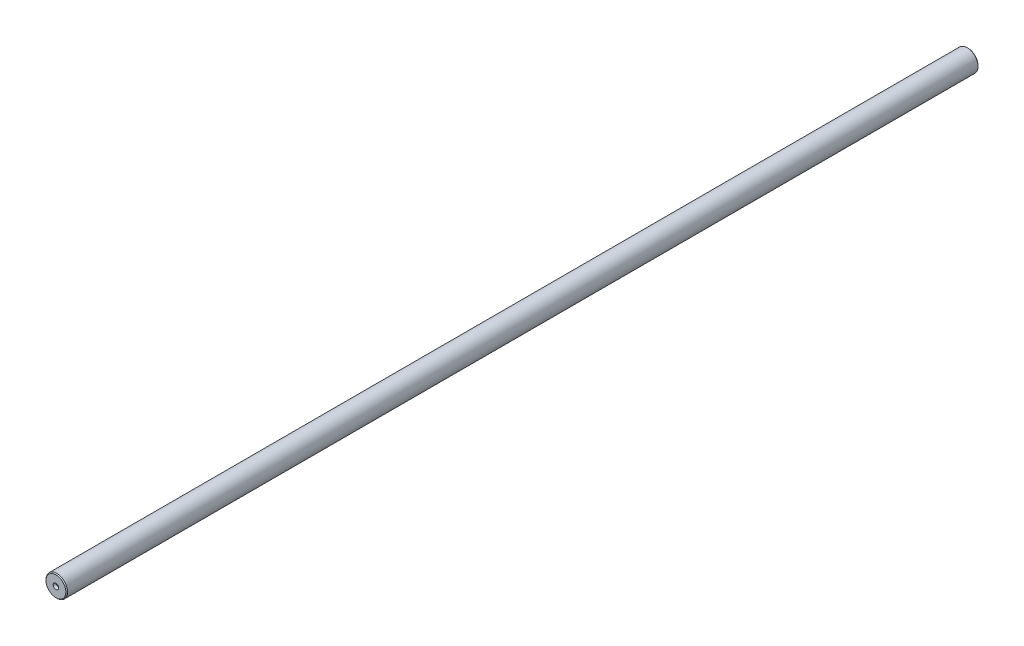
ISO-10303-21;
HEADER;
FILE_DESCRIPTION(('STEP AP214'),'2;1');
FILE_NAME('part.step','',(''),(''),'','','');
FILE_SCHEMA(('AUTOMOTIVE_DESIGN { 1 0 10303 214 1 1 1 1 }'));
ENDSEC;
DATA;
#1=APPLICATION_CONTEXT('core data for automotive mechanical design processes');
#2=APPLICATION_PROTOCOL_DEFINITION('international standard','automotive_design',2000,#1);
#3=PRODUCT_CONTEXT('',#1,'mechanical');
#4=PRODUCT('Part','Part','',(#3));
#5=PRODUCT_RELATED_PRODUCT_CATEGORY('part','',(#4));
#6=PRODUCT_DEFINITION_FORMATION('','',#4);
#7=PRODUCT_DEFINITION_CONTEXT('part definition',#1,'design');
#8=PRODUCT_DEFINITION('design','',#6,#7);
#9=PRODUCT_DEFINITION_SHAPE('','',#8);
#10=(LENGTH_UNIT() NAMED_UNIT(*) SI_UNIT(.MILLI.,.METRE.));
#11=(NAMED_UNIT(*) PLANE_ANGLE_UNIT() SI_UNIT($,.RADIAN.));
#12=(NAMED_UNIT(*) SI_UNIT($,.STERADIAN.) SOLID_ANGLE_UNIT());
#13=UNCERTAINTY_MEASURE_WITH_UNIT(LENGTH_MEASURE(1.E-05),#10,'distance_accuracy_value','');
#14=(GEOMETRIC_REPRESENTATION_CONTEXT(3) GLOBAL_UNCERTAINTY_ASSIGNED_CONTEXT((#13)) GLOBAL_UNIT_ASSIGNED_CONTEXT((#10,
#11,#12)) REPRESENTATION_CONTEXT('',''));
#15=CARTESIAN_POINT('',(0.,0.,0.));
#16=DIRECTION('',(0.,0.,1.));
#17=DIRECTION('',(1.,0.,0.));
#18=AXIS2_PLACEMENT_3D('',#15,#16,#17);
#19=CARTESIAN_POINT('',(0.,0.,528.));
#20=DIRECTION('',(0.,0.,-1.));
#21=DIRECTION('',(-1.,0.,0.));
#22=AXIS2_PLACEMENT_3D('',#19,#20,#21);
#23=CYLINDRICAL_SURFACE('',#22,12.5);
#24=CARTESIAN_POINT('',(0.,0.,527.));
#25=DIRECTION('',(0.,0.,1.));
#26=DIRECTION('',(1.,0.,0.));
#27=AXIS2_PLACEMENT_3D('',#24,#25,#26);
#28=CIRCLE('',#27,12.5);
#29=CARTESIAN_POINT('',(12.5,0.,527.));
#30=VERTEX_POINT('',#29);
#31=EDGE_CURVE('E55',#30,#30,#28,.F.);
#32=ORIENTED_EDGE('',*,*,#31,.T.);
#33=EDGE_LOOP('',(#32));
#34=FACE_BOUND('',#33,.T.);
#35=CARTESIAN_POINT('',(0.,0.,-527.));
#36=DIRECTION('',(0.,0.,1.));
#37=DIRECTION('',(1.,0.,0.));
#38=AXIS2_PLACEMENT_3D('',#35,#36,#37);
#39=CIRCLE('',#38,12.5);
#40=CARTESIAN_POINT('',(12.5,0.,-527.));
#41=VERTEX_POINT('',#40);
#42=EDGE_CURVE('E96',#41,#41,#39,.T.);
#43=ORIENTED_EDGE('',*,*,#42,.T.);
#44=EDGE_LOOP('',(#43));
#45=FACE_BOUND('',#44,.T.);
#46=ADVANCED_FACE('F45',(#34,#45),#23,.T.);
#47=CARTESIAN_POINT('',(0.,0.,528.));
#48=DIRECTION('',(0.,0.,1.));
#49=DIRECTION('',(1.,0.,0.));
#50=AXIS2_PLACEMENT_3D('',#47,#48,#49);
#51=PLANE('',#50);
#52=CARTESIAN_POINT('',(0.,0.,528.));
#53=DIRECTION('',(0.,0.,1.));
#54=DIRECTION('',(1.,0.,0.));
#55=AXIS2_PLACEMENT_3D('',#52,#53,#54);
#56=CIRCLE('',#55,11.5000000000001);
#57=CARTESIAN_POINT('',(11.5000000000001,0.,528.));
#58=VERTEX_POINT('',#57);
#59=EDGE_CURVE('E92',#58,#58,#56,.T.);
#60=ORIENTED_EDGE('',*,*,#59,.T.);
#61=EDGE_LOOP('',(#60));
#62=FACE_BOUND('',#61,.T.);
#63=CARTESIAN_POINT('',(0.,0.,528.));
#64=DIRECTION('',(0.,0.,1.));
#65=DIRECTION('',(1.,0.,0.));
#66=AXIS2_PLACEMENT_3D('',#63,#64,#65);
#67=CIRCLE('',#66,3.15);
#68=CARTESIAN_POINT('',(3.15,0.,528.));
#69=VERTEX_POINT('',#68);
#70=EDGE_CURVE('E81',#69,#69,#67,.T.);
#71=ORIENTED_EDGE('',*,*,#70,.F.);
#72=EDGE_LOOP('',(#71));
#73=FACE_BOUND('',#72,.T.);
#74=ADVANCED_FACE('F111',(#62,#73),#51,.T.);
#75=CARTESIAN_POINT('',(0.,0.,-528.));
#76=DIRECTION('',(0.,0.,1.));
#77=DIRECTION('',(1.,0.,0.));
#78=AXIS2_PLACEMENT_3D('',#75,#76,#77);
#79=PLANE('',#78);
#80=CARTESIAN_POINT('',(0.,0.,-528.));
#81=DIRECTION('',(0.,0.,1.));
#82=DIRECTION('',(1.,0.,0.));
#83=AXIS2_PLACEMENT_3D('',#80,#81,#82);
#84=CIRCLE('',#83,11.4999999999998);
#85=CARTESIAN_POINT('',(11.4999999999998,0.,-528.));
#86=VERTEX_POINT('',#85);
#87=EDGE_CURVE('E11',#86,#86,#84,.F.);
#88=ORIENTED_EDGE('',*,*,#87,.T.);
#89=EDGE_LOOP('',(#88));
#90=FACE_BOUND('',#89,.T.);
#91=CARTESIAN_POINT('',(0.,0.,-528.));
#92=DIRECTION('',(0.,0.,-1.));
#93=DIRECTION('',(-1.,0.,0.));
#94=AXIS2_PLACEMENT_3D('',#91,#92,#93);
#95=CIRCLE('',#94,3.15);
#96=CARTESIAN_POINT('',(-3.15,0.,-528.));
#97=VERTEX_POINT('',#96);
#98=EDGE_CURVE('E72',#97,#97,#95,.T.);
#99=ORIENTED_EDGE('',*,*,#98,.F.);
#100=EDGE_LOOP('',(#99));
#101=FACE_BOUND('',#100,.T.);
#102=ADVANCED_FACE('F114',(#90,#101),#79,.F.);
#103=CARTESIAN_POINT('',(0.,0.,-519.021463052347));
#104=DIRECTION('',(0.,0.,-1.));
#105=DIRECTION('',(-1.,0.,0.));
#106=AXIS2_PLACEMENT_3D('',#103,#104,#105);
#107=CONICAL_SURFACE('',#106,1.7,1.02974425867665);
#108=CARTESIAN_POINT('',(0.,0.,-518.));
#109=VERTEX_POINT('',#108);
#110=VERTEX_LOOP('',#109);
#111=FACE_BOUND('',#110,.T.);
#112=CARTESIAN_POINT('',(0.,0.,-519.021463052347));
#113=DIRECTION('',(0.,0.,-1.));
#114=DIRECTION('',(-1.,0.,0.));
#115=AXIS2_PLACEMENT_3D('',#112,#113,#114);
#116=CIRCLE('',#115,1.7);
#117=CARTESIAN_POINT('',(-1.7,0.,-519.021463052347));
#118=VERTEX_POINT('',#117);
#119=EDGE_CURVE('E88',#118,#118,#116,.T.);
#120=ORIENTED_EDGE('',*,*,#119,.T.);
#121=EDGE_LOOP('',(#120));
#122=FACE_BOUND('',#121,.T.);
#123=ADVANCED_FACE('F139',(#111,#122),#107,.F.);
#124=CARTESIAN_POINT('',(0.,0.,-528.));
#125=DIRECTION('',(0.,0.,-1.));
#126=DIRECTION('',(-1.,0.,0.));
#127=AXIS2_PLACEMENT_3D('',#124,#125,#126);
#128=CYLINDRICAL_SURFACE('',#127,1.7);
#129=ORIENTED_EDGE('',*,*,#119,.F.);
#130=EDGE_LOOP('',(#129));
#131=FACE_BOUND('',#130,.T.);
#132=CARTESIAN_POINT('',(0.,0.,-525.488526329025));
#133=DIRECTION('',(0.,0.,-1.));
#134=DIRECTION('',(-1.,0.,0.));
#135=AXIS2_PLACEMENT_3D('',#132,#133,#134);
#136=CIRCLE('',#135,1.7);
#137=CARTESIAN_POINT('',(-1.7,0.,-525.488526329025));
#138=VERTEX_POINT('',#137);
#139=EDGE_CURVE('E78',#138,#138,#136,.T.);
#140=ORIENTED_EDGE('',*,*,#139,.T.);
#141=EDGE_LOOP('',(#140));
#142=FACE_BOUND('',#141,.T.);
#143=ADVANCED_FACE('F144',(#131,#142),#128,.F.);
#144=CARTESIAN_POINT('',(0.,0.,-528.));
#145=DIRECTION('',(0.,0.,-1.));
#146=DIRECTION('',(-1.,0.,0.));
#147=AXIS2_PLACEMENT_3D('',#144,#145,#146);
#148=CONICAL_SURFACE('',#147,3.15,0.523598775598309);
#149=ORIENTED_EDGE('',*,*,#139,.F.);
#150=EDGE_LOOP('',(#149));
#151=FACE_BOUND('',#150,.T.);
#152=ORIENTED_EDGE('',*,*,#98,.T.);
#153=EDGE_LOOP('',(#152));
#154=FACE_BOUND('',#153,.T.);
#155=ADVANCED_FACE('F65',(#151,#154),#148,.F.);
#156=CARTESIAN_POINT('',(0.,0.,519.021463052347));
#157=DIRECTION('',(0.,0.,1.));
#158=DIRECTION('',(1.,0.,0.));
#159=AXIS2_PLACEMENT_3D('',#156,#157,#158);
#160=CONICAL_SURFACE('',#159,1.7,1.02974425867665);
#161=CARTESIAN_POINT('',(0.,0.,518.));
#162=VERTEX_POINT('',#161);
#163=VERTEX_LOOP('',#162);
#164=FACE_BOUND('',#163,.T.);
#165=CARTESIAN_POINT('',(0.,0.,519.021463052347));
#166=DIRECTION('',(0.,0.,1.));
#167=DIRECTION('',(1.,0.,0.));
#168=AXIS2_PLACEMENT_3D('',#165,#166,#167);
#169=CIRCLE('',#168,1.7);
#170=CARTESIAN_POINT('',(1.7,0.,519.021463052347));
#171=VERTEX_POINT('',#170);
#172=EDGE_CURVE('E69',#171,#171,#169,.T.);
#173=ORIENTED_EDGE('',*,*,#172,.T.);
#174=EDGE_LOOP('',(#173));
#175=FACE_BOUND('',#174,.T.);
#176=ADVANCED_FACE('F61',(#164,#175),#160,.F.);
#177=CARTESIAN_POINT('',(0.,0.,528.));
#178=DIRECTION('',(0.,0.,1.));
#179=DIRECTION('',(1.,0.,0.));
#180=AXIS2_PLACEMENT_3D('',#177,#178,#179);
#181=CYLINDRICAL_SURFACE('',#180,1.7);
#182=ORIENTED_EDGE('',*,*,#172,.F.);
#183=EDGE_LOOP('',(#182));
#184=FACE_BOUND('',#183,.T.);
#185=CARTESIAN_POINT('',(0.,0.,525.488526329025));
#186=DIRECTION('',(0.,0.,1.));
#187=DIRECTION('',(1.,0.,0.));
#188=AXIS2_PLACEMENT_3D('',#185,#186,#187);
#189=CIRCLE('',#188,1.7);
#190=CARTESIAN_POINT('',(1.7,0.,525.488526329025));
#191=VERTEX_POINT('',#190);
#192=EDGE_CURVE('E73',#191,#191,#189,.T.);
#193=ORIENTED_EDGE('',*,*,#192,.T.);
#194=EDGE_LOOP('',(#193));
#195=FACE_BOUND('',#194,.T.);
#196=ADVANCED_FACE('F64',(#184,#195),#181,.F.);
#197=CARTESIAN_POINT('',(0.,0.,528.));
#198=DIRECTION('',(0.,0.,1.));
#199=DIRECTION('',(1.,0.,0.));
#200=AXIS2_PLACEMENT_3D('',#197,#198,#199);
#201=CONICAL_SURFACE('',#200,3.15,0.523598775598309);
#202=ORIENTED_EDGE('',*,*,#192,.F.);
#203=EDGE_LOOP('',(#202));
#204=FACE_BOUND('',#203,.T.);
#205=ORIENTED_EDGE('',*,*,#70,.T.);
#206=EDGE_LOOP('',(#205));
#207=FACE_BOUND('',#206,.T.);
#208=ADVANCED_FACE('F108',(#204,#207),#201,.F.);
#209=CARTESIAN_POINT('',(0.,0.,528.));
#210=DIRECTION('',(0.,0.,-1.));
#211=DIRECTION('',(-1.,0.,0.));
#212=AXIS2_PLACEMENT_3D('',#209,#210,#211);
#213=CONICAL_SURFACE('',#212,11.5000000000001,0.785398163397415);
#214=ORIENTED_EDGE('',*,*,#31,.F.);
#215=EDGE_LOOP('',(#214));
#216=FACE_BOUND('',#215,.T.);
#217=ORIENTED_EDGE('',*,*,#59,.F.);
#218=EDGE_LOOP('',(#217));
#219=FACE_BOUND('',#218,.T.);
#220=ADVANCED_FACE('F105',(#216,#219),#213,.T.);
#221=CARTESIAN_POINT('',(0.,0.,-527.));
#222=DIRECTION('',(0.,0.,1.));
#223=DIRECTION('',(1.,0.,0.));
#224=AXIS2_PLACEMENT_3D('',#221,#222,#223);
#225=CONICAL_SURFACE('',#224,12.5,0.785398163397582);
#226=ORIENTED_EDGE('',*,*,#87,.F.);
#227=EDGE_LOOP('',(#226));
#228=FACE_BOUND('',#227,.T.);
#229=ORIENTED_EDGE('',*,*,#42,.F.);
#230=EDGE_LOOP('',(#229));
#231=FACE_BOUND('',#230,.T.);
#232=ADVANCED_FACE('F48',(#228,#231),#225,.T.);
#233=CLOSED_SHELL('',(#46,#74,#102,#123,#143,#155,#176,#196,#208,#220,#232));
#234=MANIFOLD_SOLID_BREP('B2',#233);
#235=ADVANCED_BREP_SHAPE_REPRESENTATION('',(#18,#234),#14);
#236=SHAPE_DEFINITION_REPRESENTATION(#9,#235);
ENDSEC;
END-ISO-10303-21;
